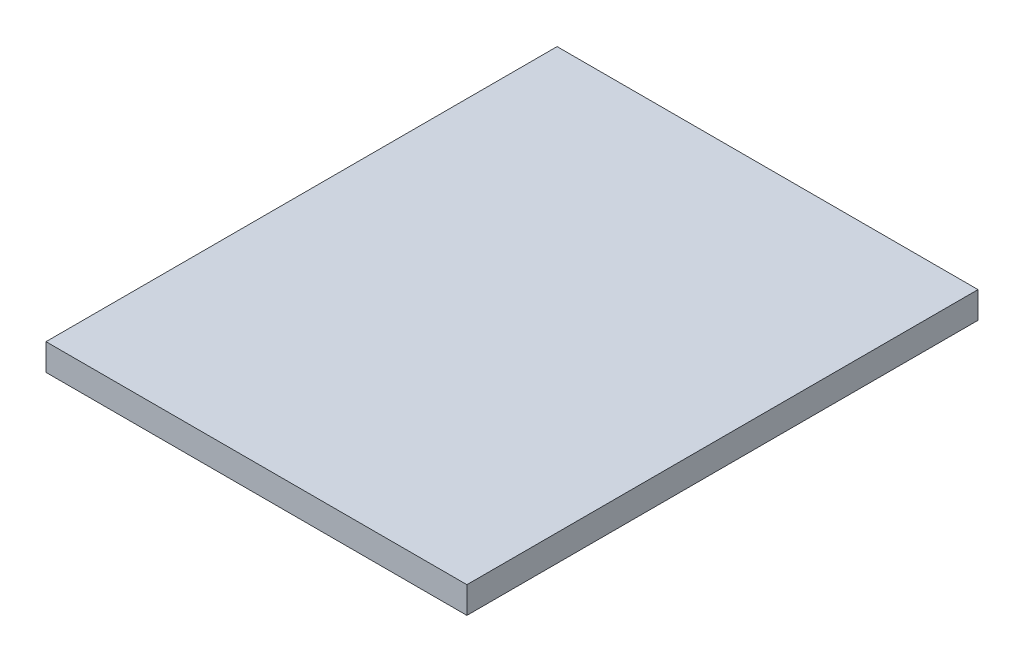
ISO-10303-21;
HEADER;
FILE_DESCRIPTION(('STEP AP214'),'2;1');
FILE_NAME('part.step','',(''),(''),'','','');
FILE_SCHEMA(('AUTOMOTIVE_DESIGN { 1 0 10303 214 1 1 1 1 }'));
ENDSEC;
DATA;
#1=APPLICATION_CONTEXT('core data for automotive mechanical design processes');
#2=APPLICATION_PROTOCOL_DEFINITION('international standard','automotive_design',2000,#1);
#3=PRODUCT_CONTEXT('',#1,'mechanical');
#4=PRODUCT('Part','Part','',(#3));
#5=PRODUCT_RELATED_PRODUCT_CATEGORY('part','',(#4));
#6=PRODUCT_DEFINITION_FORMATION('','',#4);
#7=PRODUCT_DEFINITION_CONTEXT('part definition',#1,'design');
#8=PRODUCT_DEFINITION('design','',#6,#7);
#9=PRODUCT_DEFINITION_SHAPE('','',#8);
#10=(LENGTH_UNIT() NAMED_UNIT(*) SI_UNIT(.MILLI.,.METRE.));
#11=(NAMED_UNIT(*) PLANE_ANGLE_UNIT() SI_UNIT($,.RADIAN.));
#12=(NAMED_UNIT(*) SI_UNIT($,.STERADIAN.) SOLID_ANGLE_UNIT());
#13=UNCERTAINTY_MEASURE_WITH_UNIT(LENGTH_MEASURE(1.E-05),#10,'distance_accuracy_value','');
#14=(GEOMETRIC_REPRESENTATION_CONTEXT(3) GLOBAL_UNCERTAINTY_ASSIGNED_CONTEXT((#13)) GLOBAL_UNIT_ASSIGNED_CONTEXT((#10,
#11,#12)) REPRESENTATION_CONTEXT('',''));
#15=CARTESIAN_POINT('',(0.,0.,0.));
#16=DIRECTION('',(0.,0.,1.));
#17=DIRECTION('',(1.,0.,0.));
#18=AXIS2_PLACEMENT_3D('',#15,#16,#17);
#19=CARTESIAN_POINT('',(5.5372,2.9756,-1.3462));
#20=DIRECTION('',(1.,0.,0.));
#21=DIRECTION('',(0.,-1.,0.));
#22=AXIS2_PLACEMENT_3D('',#19,#20,#21);
#23=PLANE('',#22);
#24=DIRECTION('',(0.,0.,1.));
#25=VECTOR('',#24,1.);
#26=CARTESIAN_POINT('',(5.5372,2.9306,-1.3462));
#27=LINE('',#26,#25);
#28=CARTESIAN_POINT('',(5.5372,2.9306,-2.2098));
#29=VERTEX_POINT('',#28);
#30=CARTESIAN_POINT('',(5.5372,2.9306,-1.3462));
#31=VERTEX_POINT('',#30);
#32=EDGE_CURVE('E11',#29,#31,#27,.T.);
#33=ORIENTED_EDGE('',*,*,#32,.T.);
#34=DIRECTION('',(0.,-1.,0.));
#35=VECTOR('',#34,1.);
#36=CARTESIAN_POINT('',(5.5372,2.9756,-1.3462));
#37=LINE('',#36,#35);
#38=CARTESIAN_POINT('',(5.5372,2.9756,-1.3462));
#39=VERTEX_POINT('',#38);
#40=EDGE_CURVE('E24',#39,#31,#37,.T.);
#41=ORIENTED_EDGE('',*,*,#40,.F.);
#42=DIRECTION('',(0.,0.,1.));
#43=VECTOR('',#42,1.);
#44=CARTESIAN_POINT('',(5.5372,2.9756,-1.3462));
#45=LINE('',#44,#43);
#46=CARTESIAN_POINT('',(5.5372,2.9756,-2.2098));
#47=VERTEX_POINT('',#46);
#48=EDGE_CURVE('E88',#47,#39,#45,.T.);
#49=ORIENTED_EDGE('',*,*,#48,.F.);
#50=DIRECTION('',(0.,-1.,0.));
#51=VECTOR('',#50,1.);
#52=CARTESIAN_POINT('',(5.5372,2.9756,-2.2098));
#53=LINE('',#52,#51);
#54=EDGE_CURVE('E77',#47,#29,#53,.T.);
#55=ORIENTED_EDGE('',*,*,#54,.T.);
#56=EDGE_LOOP('',(#33,#41,#49,#55));
#57=FACE_BOUND('',#56,.T.);
#58=ADVANCED_FACE('F17',(#57),#23,.F.);
#59=CARTESIAN_POINT('',(6.2484,2.9756,-1.3462));
#60=DIRECTION('',(0.,0.,-1.));
#61=DIRECTION('',(0.,1.,0.));
#62=AXIS2_PLACEMENT_3D('',#59,#60,#61);
#63=PLANE('',#62);
#64=DIRECTION('',(1.,0.,0.));
#65=VECTOR('',#64,1.);
#66=CARTESIAN_POINT('',(6.2484,2.9306,-1.3462));
#67=LINE('',#66,#65);
#68=CARTESIAN_POINT('',(6.2484,2.9306,-1.3462));
#69=VERTEX_POINT('',#68);
#70=EDGE_CURVE('E85',#31,#69,#67,.T.);
#71=ORIENTED_EDGE('',*,*,#70,.T.);
#72=DIRECTION('',(0.,-1.,0.));
#73=VECTOR('',#72,1.);
#74=CARTESIAN_POINT('',(6.2484,2.9756,-1.3462));
#75=LINE('',#74,#73);
#76=CARTESIAN_POINT('',(6.2484,2.9756,-1.3462));
#77=VERTEX_POINT('',#76);
#78=EDGE_CURVE('E83',#77,#69,#75,.T.);
#79=ORIENTED_EDGE('',*,*,#78,.F.);
#80=DIRECTION('',(1.,0.,0.));
#81=VECTOR('',#80,1.);
#82=CARTESIAN_POINT('',(6.2484,2.9756,-1.3462));
#83=LINE('',#82,#81);
#84=EDGE_CURVE('E72',#39,#77,#83,.T.);
#85=ORIENTED_EDGE('',*,*,#84,.F.);
#86=ORIENTED_EDGE('',*,*,#40,.T.);
#87=EDGE_LOOP('',(#71,#79,#85,#86));
#88=FACE_BOUND('',#87,.T.);
#89=ADVANCED_FACE('F90',(#88),#63,.F.);
#90=CARTESIAN_POINT('',(6.2484,2.9756,-2.2098));
#91=DIRECTION('',(-1.,0.,0.));
#92=DIRECTION('',(0.,1.,0.));
#93=AXIS2_PLACEMENT_3D('',#90,#91,#92);
#94=PLANE('',#93);
#95=DIRECTION('',(0.,0.,-1.));
#96=VECTOR('',#95,1.);
#97=CARTESIAN_POINT('',(6.2484,2.9306,-2.2098));
#98=LINE('',#97,#96);
#99=CARTESIAN_POINT('',(6.2484,2.9306,-2.2098));
#100=VERTEX_POINT('',#99);
#101=EDGE_CURVE('E60',#69,#100,#98,.T.);
#102=ORIENTED_EDGE('',*,*,#101,.T.);
#103=DIRECTION('',(0.,-1.,0.));
#104=VECTOR('',#103,1.);
#105=CARTESIAN_POINT('',(6.2484,2.9756,-2.2098));
#106=LINE('',#105,#104);
#107=CARTESIAN_POINT('',(6.2484,2.9756,-2.2098));
#108=VERTEX_POINT('',#107);
#109=EDGE_CURVE('E54',#108,#100,#106,.T.);
#110=ORIENTED_EDGE('',*,*,#109,.F.);
#111=DIRECTION('',(0.,0.,-1.));
#112=VECTOR('',#111,1.);
#113=CARTESIAN_POINT('',(6.2484,2.9756,-2.2098));
#114=LINE('',#113,#112);
#115=EDGE_CURVE('E58',#77,#108,#114,.T.);
#116=ORIENTED_EDGE('',*,*,#115,.F.);
#117=ORIENTED_EDGE('',*,*,#78,.T.);
#118=EDGE_LOOP('',(#102,#110,#116,#117));
#119=FACE_BOUND('',#118,.T.);
#120=ADVANCED_FACE('F56',(#119),#94,.F.);
#121=CARTESIAN_POINT('',(5.5372,2.9756,-2.2098));
#122=DIRECTION('',(0.,0.,1.));
#123=DIRECTION('',(0.,-1.,0.));
#124=AXIS2_PLACEMENT_3D('',#121,#122,#123);
#125=PLANE('',#124);
#126=DIRECTION('',(-1.,0.,0.));
#127=VECTOR('',#126,1.);
#128=CARTESIAN_POINT('',(5.5372,2.9306,-2.2098));
#129=LINE('',#128,#127);
#130=EDGE_CURVE('E73',#100,#29,#129,.T.);
#131=ORIENTED_EDGE('',*,*,#130,.T.);
#132=ORIENTED_EDGE('',*,*,#54,.F.);
#133=DIRECTION('',(-1.,0.,0.));
#134=VECTOR('',#133,1.);
#135=CARTESIAN_POINT('',(5.5372,2.9756,-2.2098));
#136=LINE('',#135,#134);
#137=EDGE_CURVE('E70',#108,#47,#136,.T.);
#138=ORIENTED_EDGE('',*,*,#137,.F.);
#139=ORIENTED_EDGE('',*,*,#109,.T.);
#140=EDGE_LOOP('',(#131,#132,#138,#139));
#141=FACE_BOUND('',#140,.T.);
#142=ADVANCED_FACE('F76',(#141),#125,.F.);
#143=CARTESIAN_POINT('',(0.,2.9756,0.));
#144=DIRECTION('',(0.,-1.,0.));
#145=DIRECTION('',(-1.,0.,0.));
#146=AXIS2_PLACEMENT_3D('',#143,#144,#145);
#147=PLANE('',#146);
#148=ORIENTED_EDGE('',*,*,#48,.T.);
#149=ORIENTED_EDGE('',*,*,#84,.T.);
#150=ORIENTED_EDGE('',*,*,#115,.T.);
#151=ORIENTED_EDGE('',*,*,#137,.T.);
#152=EDGE_LOOP('',(#148,#149,#150,#151));
#153=FACE_BOUND('',#152,.T.);
#154=ADVANCED_FACE('F69',(#153),#147,.F.);
#155=CARTESIAN_POINT('',(0.,2.9306,0.));
#156=DIRECTION('',(0.,-1.,0.));
#157=DIRECTION('',(-1.,0.,0.));
#158=AXIS2_PLACEMENT_3D('',#155,#156,#157);
#159=PLANE('',#158);
#160=ORIENTED_EDGE('',*,*,#32,.F.);
#161=ORIENTED_EDGE('',*,*,#130,.F.);
#162=ORIENTED_EDGE('',*,*,#101,.F.);
#163=ORIENTED_EDGE('',*,*,#70,.F.);
#164=EDGE_LOOP('',(#160,#161,#162,#163));
#165=FACE_BOUND('',#164,.T.);
#166=ADVANCED_FACE('F91',(#165),#159,.T.);
#167=CLOSED_SHELL('',(#58,#89,#120,#142,#154,#166));
#168=MANIFOLD_SOLID_BREP('B1',#167);
#169=ADVANCED_BREP_SHAPE_REPRESENTATION('',(#18,#168),#14);
#170=SHAPE_DEFINITION_REPRESENTATION(#9,#169);
ENDSEC;
END-ISO-10303-21;
